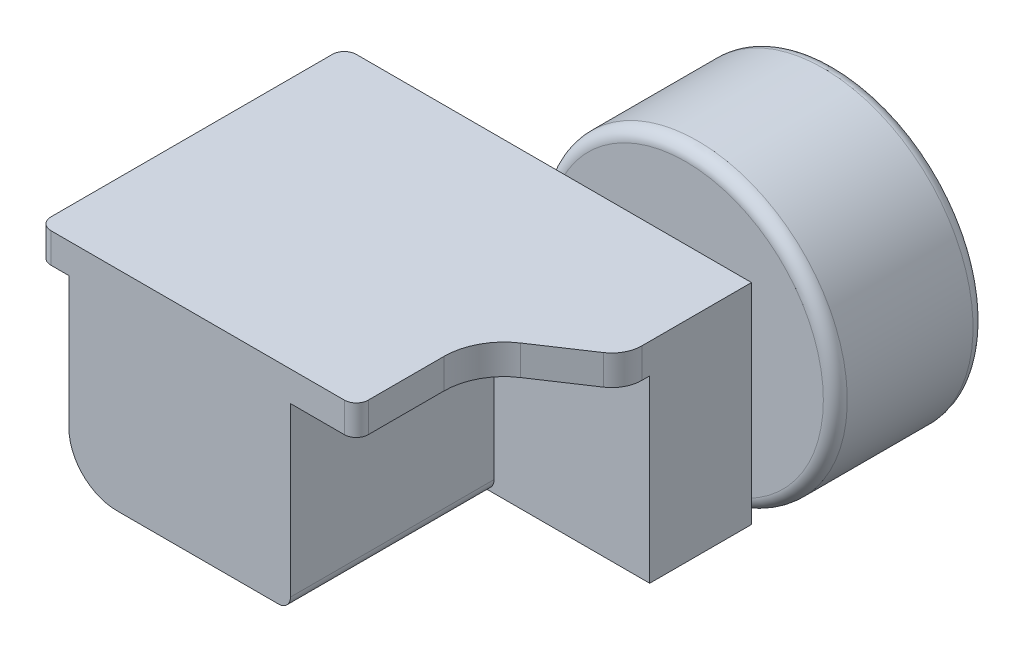
ISO-10303-21;
HEADER;
FILE_DESCRIPTION(('STEP AP214'),'2;1');
FILE_NAME('part.step','',(''),(''),'','','');
FILE_SCHEMA(('AUTOMOTIVE_DESIGN { 1 0 10303 214 1 1 1 1 }'));
ENDSEC;
DATA;
#1=APPLICATION_CONTEXT('core data for automotive mechanical design processes');
#2=APPLICATION_PROTOCOL_DEFINITION('international standard','automotive_design',2000,#1);
#3=PRODUCT_CONTEXT('',#1,'mechanical');
#4=PRODUCT('Part','Part','',(#3));
#5=PRODUCT_RELATED_PRODUCT_CATEGORY('part','',(#4));
#6=PRODUCT_DEFINITION_FORMATION('','',#4);
#7=PRODUCT_DEFINITION_CONTEXT('part definition',#1,'design');
#8=PRODUCT_DEFINITION('design','',#6,#7);
#9=PRODUCT_DEFINITION_SHAPE('','',#8);
#10=(LENGTH_UNIT() NAMED_UNIT(*) SI_UNIT(.MILLI.,.METRE.));
#11=(NAMED_UNIT(*) PLANE_ANGLE_UNIT() SI_UNIT($,.RADIAN.));
#12=(NAMED_UNIT(*) SI_UNIT($,.STERADIAN.) SOLID_ANGLE_UNIT());
#13=UNCERTAINTY_MEASURE_WITH_UNIT(LENGTH_MEASURE(1.E-05),#10,'distance_accuracy_value','');
#14=(GEOMETRIC_REPRESENTATION_CONTEXT(3) GLOBAL_UNCERTAINTY_ASSIGNED_CONTEXT((#13)) GLOBAL_UNIT_ASSIGNED_CONTEXT((#10,
#11,#12)) REPRESENTATION_CONTEXT('',''));
#15=CARTESIAN_POINT('',(0.,0.,0.));
#16=DIRECTION('',(0.,0.,1.));
#17=DIRECTION('',(1.,0.,0.));
#18=AXIS2_PLACEMENT_3D('',#15,#16,#17);
#19=CARTESIAN_POINT('',(0.,0.,51.));
#20=DIRECTION('',(1.,0.,0.));
#21=DIRECTION('',(0.,0.,-1.));
#22=AXIS2_PLACEMENT_3D('',#19,#20,#21);
#23=PLANE('',#22);
#24=DIRECTION('',(0.,0.,-1.));
#25=VECTOR('',#24,1.);
#26=CARTESIAN_POINT('',(0.,30.,51.));
#27=LINE('',#26,#25);
#28=CARTESIAN_POINT('',(0.,30.,49.));
#29=VERTEX_POINT('',#28);
#30=CARTESIAN_POINT('',(0.,30.,2.));
#31=VERTEX_POINT('',#30);
#32=EDGE_CURVE('E181',#29,#31,#27,.T.);
#33=ORIENTED_EDGE('',*,*,#32,.F.);
#34=DIRECTION('',(0.,-1.,0.));
#35=VECTOR('',#34,1.);
#36=CARTESIAN_POINT('',(0.,0.,49.));
#37=LINE('',#36,#35);
#38=CARTESIAN_POINT('',(0.,35.,49.));
#39=VERTEX_POINT('',#38);
#40=EDGE_CURVE('E353',#29,#39,#37,.F.);
#41=ORIENTED_EDGE('',*,*,#40,.T.);
#42=DIRECTION('',(0.,0.,-1.));
#43=VECTOR('',#42,1.);
#44=CARTESIAN_POINT('',(0.,35.,51.));
#45=LINE('',#44,#43);
#46=CARTESIAN_POINT('',(0.,35.,2.));
#47=VERTEX_POINT('',#46);
#48=EDGE_CURVE('E257',#39,#47,#45,.T.);
#49=ORIENTED_EDGE('',*,*,#48,.T.);
#50=DIRECTION('',(0.,-1.,0.));
#51=VECTOR('',#50,1.);
#52=CARTESIAN_POINT('',(0.,30.,2.));
#53=LINE('',#52,#51);
#54=EDGE_CURVE('E350',#47,#31,#53,.T.);
#55=ORIENTED_EDGE('',*,*,#54,.T.);
#56=EDGE_LOOP('',(#33,#41,#49,#55));
#57=FACE_BOUND('',#56,.T.);
#58=ADVANCED_FACE('F37',(#57),#23,.F.);
#59=CARTESIAN_POINT('',(0.,0.,0.));
#60=DIRECTION('',(0.,0.,-1.));
#61=DIRECTION('',(-1.,0.,0.));
#62=AXIS2_PLACEMENT_3D('',#59,#60,#61);
#63=PLANE('',#62);
#64=DIRECTION('',(1.,0.,0.));
#65=VECTOR('',#64,1.);
#66=CARTESIAN_POINT('',(0.,30.,0.));
#67=LINE('',#66,#65);
#68=CARTESIAN_POINT('',(2.,30.,0.));
#69=VERTEX_POINT('',#68);
#70=CARTESIAN_POINT('',(13.,30.,0.));
#71=VERTEX_POINT('',#70);
#72=EDGE_CURVE('E170',#69,#71,#67,.T.);
#73=ORIENTED_EDGE('',*,*,#72,.F.);
#74=DIRECTION('',(0.,-1.,0.));
#75=VECTOR('',#74,1.);
#76=CARTESIAN_POINT('',(2.,35.,0.));
#77=LINE('',#76,#75);
#78=CARTESIAN_POINT('',(2.,35.,0.));
#79=VERTEX_POINT('',#78);
#80=EDGE_CURVE('E12',#69,#79,#77,.F.);
#81=ORIENTED_EDGE('',*,*,#80,.T.);
#82=DIRECTION('',(-1.,0.,0.));
#83=VECTOR('',#82,1.);
#84=CARTESIAN_POINT('',(0.,35.,0.));
#85=LINE('',#84,#83);
#86=CARTESIAN_POINT('',(68.,35.,0.));
#87=VERTEX_POINT('',#86);
#88=EDGE_CURVE('E254',#87,#79,#85,.T.);
#89=ORIENTED_EDGE('',*,*,#88,.F.);
#90=DIRECTION('',(0.,1.,0.));
#91=VECTOR('',#90,1.);
#92=CARTESIAN_POINT('',(68.,0.,0.));
#93=LINE('',#92,#91);
#94=CARTESIAN_POINT('',(68.,0.,0.));
#95=VERTEX_POINT('',#94);
#96=EDGE_CURVE('E259',#95,#87,#93,.T.);
#97=ORIENTED_EDGE('',*,*,#96,.F.);
#98=DIRECTION('',(1.,0.,0.));
#99=VECTOR('',#98,1.);
#100=CARTESIAN_POINT('',(0.,0.,0.));
#101=LINE('',#100,#99);
#102=CARTESIAN_POINT('',(13.,0.,0.));
#103=VERTEX_POINT('',#102);
#104=EDGE_CURVE('E197',#103,#95,#101,.T.);
#105=ORIENTED_EDGE('',*,*,#104,.F.);
#106=DIRECTION('',(0.,-1.,0.));
#107=VECTOR('',#106,1.);
#108=CARTESIAN_POINT('',(13.,30.,0.));
#109=LINE('',#108,#107);
#110=EDGE_CURVE('E186',#71,#103,#109,.T.);
#111=ORIENTED_EDGE('',*,*,#110,.F.);
#112=EDGE_LOOP('',(#73,#81,#89,#97,#105,#111));
#113=FACE_BOUND('',#112,.T.);
#114=CARTESIAN_POINT('',(50.,17.,0.));
#115=DIRECTION('',(0.,0.,-1.));
#116=DIRECTION('',(-1.,0.,0.));
#117=AXIS2_PLACEMENT_3D('',#114,#115,#116);
#118=CIRCLE('',#117,6.);
#119=CARTESIAN_POINT('',(44.,17.,0.));
#120=VERTEX_POINT('',#119);
#121=EDGE_CURVE('E244',#120,#120,#118,.T.);
#122=ORIENTED_EDGE('',*,*,#121,.F.);
#123=EDGE_LOOP('',(#122));
#124=FACE_BOUND('',#123,.T.);
#125=ADVANCED_FACE('F194',(#113,#124),#63,.T.);
#126=CARTESIAN_POINT('',(0.,0.,51.));
#127=DIRECTION('',(0.,1.,0.));
#128=DIRECTION('',(0.,0.,1.));
#129=AXIS2_PLACEMENT_3D('',#126,#127,#128);
#130=PLANE('',#129);
#131=DIRECTION('',(1.,0.,0.));
#132=VECTOR('',#131,1.);
#133=CARTESIAN_POINT('',(68.,0.,17.));
#134=LINE('',#133,#132);
#135=CARTESIAN_POINT('',(40.,0.,17.));
#136=VERTEX_POINT('',#135);
#137=CARTESIAN_POINT('',(68.,0.,17.));
#138=VERTEX_POINT('',#137);
#139=EDGE_CURVE('E209',#136,#138,#134,.T.);
#140=ORIENTED_EDGE('',*,*,#139,.F.);
#141=DIRECTION('',(0.,0.,-1.));
#142=VECTOR('',#141,1.);
#143=CARTESIAN_POINT('',(40.,0.,51.));
#144=LINE('',#143,#142);
#145=CARTESIAN_POINT('',(40.,0.,51.));
#146=VERTEX_POINT('',#145);
#147=EDGE_CURVE('E334',#136,#146,#144,.F.);
#148=ORIENTED_EDGE('',*,*,#147,.T.);
#149=DIRECTION('',(1.,0.,0.));
#150=VECTOR('',#149,1.);
#151=CARTESIAN_POINT('',(0.,0.,51.));
#152=LINE('',#151,#150);
#153=CARTESIAN_POINT('',(13.,0.,51.));
#154=VERTEX_POINT('',#153);
#155=EDGE_CURVE('E250',#154,#146,#152,.T.);
#156=ORIENTED_EDGE('',*,*,#155,.F.);
#157=DIRECTION('',(0.,0.,1.));
#158=VECTOR('',#157,1.);
#159=CARTESIAN_POINT('',(13.,0.,51.));
#160=LINE('',#159,#158);
#161=CARTESIAN_POINT('',(13.,0.,14.));
#162=VERTEX_POINT('',#161);
#163=EDGE_CURVE('E327',#154,#162,#160,.F.);
#164=ORIENTED_EDGE('',*,*,#163,.T.);
#165=DIRECTION('',(0.,0.,1.));
#166=VECTOR('',#165,1.);
#167=CARTESIAN_POINT('',(13.,0.,0.));
#168=LINE('',#167,#166);
#169=EDGE_CURVE('E447',#103,#162,#168,.T.);
#170=ORIENTED_EDGE('',*,*,#169,.F.);
#171=ORIENTED_EDGE('',*,*,#104,.T.);
#172=DIRECTION('',(0.,0.,-1.));
#173=VECTOR('',#172,1.);
#174=CARTESIAN_POINT('',(68.,0.,51.));
#175=LINE('',#174,#173);
#176=EDGE_CURVE('E268',#138,#95,#175,.T.);
#177=ORIENTED_EDGE('',*,*,#176,.F.);
#178=EDGE_LOOP('',(#140,#148,#156,#164,#170,#171,#177));
#179=FACE_BOUND('',#178,.T.);
#180=ADVANCED_FACE('F388',(#179),#130,.F.);
#181=CARTESIAN_POINT('',(68.,0.,51.));
#182=DIRECTION('',(-1.,0.,0.));
#183=DIRECTION('',(0.,0.,1.));
#184=AXIS2_PLACEMENT_3D('',#181,#182,#183);
#185=PLANE('',#184);
#186=DIRECTION('',(0.,0.,1.));
#187=VECTOR('',#186,1.);
#188=CARTESIAN_POINT('',(68.,30.,51.));
#189=LINE('',#188,#187);
#190=CARTESIAN_POINT('',(68.,30.,17.));
#191=VERTEX_POINT('',#190);
#192=CARTESIAN_POINT('',(68.,30.,18.32408120756));
#193=VERTEX_POINT('',#192);
#194=EDGE_CURVE('E206',#191,#193,#189,.T.);
#195=ORIENTED_EDGE('',*,*,#194,.F.);
#196=DIRECTION('',(0.,-1.,0.));
#197=VECTOR('',#196,1.);
#198=CARTESIAN_POINT('',(68.,30.,17.));
#199=LINE('',#198,#197);
#200=EDGE_CURVE('E220',#191,#138,#199,.T.);
#201=ORIENTED_EDGE('',*,*,#200,.T.);
#202=ORIENTED_EDGE('',*,*,#176,.T.);
#203=ORIENTED_EDGE('',*,*,#96,.T.);
#204=DIRECTION('',(0.,0.,-1.));
#205=VECTOR('',#204,1.);
#206=CARTESIAN_POINT('',(68.,35.,51.));
#207=LINE('',#206,#205);
#208=CARTESIAN_POINT('',(68.,35.,18.32408120756));
#209=VERTEX_POINT('',#208);
#210=EDGE_CURVE('E266',#209,#87,#207,.T.);
#211=ORIENTED_EDGE('',*,*,#210,.F.);
#212=DIRECTION('',(0.,-1.,0.));
#213=VECTOR('',#212,1.);
#214=CARTESIAN_POINT('',(68.,0.,18.32408120756));
#215=LINE('',#214,#213);
#216=EDGE_CURVE('E313',#209,#193,#215,.T.);
#217=ORIENTED_EDGE('',*,*,#216,.T.);
#218=EDGE_LOOP('',(#195,#201,#202,#203,#211,#217));
#219=FACE_BOUND('',#218,.T.);
#220=ADVANCED_FACE('F445',(#219),#185,.F.);
#221=CARTESIAN_POINT('',(0.,35.,51.));
#222=DIRECTION('',(0.,-1.,0.));
#223=DIRECTION('',(0.,0.,-1.));
#224=AXIS2_PLACEMENT_3D('',#221,#222,#223);
#225=PLANE('',#224);
#226=ORIENTED_EDGE('',*,*,#48,.F.);
#227=CARTESIAN_POINT('',(2.,35.,49.));
#228=DIRECTION('',(0.,-1.,0.));
#229=DIRECTION('',(0.,0.,-1.));
#230=AXIS2_PLACEMENT_3D('',#227,#228,#229);
#231=CIRCLE('',#230,2.);
#232=CARTESIAN_POINT('',(2.,35.,51.));
#233=VERTEX_POINT('',#232);
#234=EDGE_CURVE('E358',#39,#233,#231,.F.);
#235=ORIENTED_EDGE('',*,*,#234,.T.);
#236=DIRECTION('',(-1.,0.,0.));
#237=VECTOR('',#236,1.);
#238=CARTESIAN_POINT('',(0.,35.,51.));
#239=LINE('',#238,#237);
#240=CARTESIAN_POINT('',(51.,35.,51.));
#241=VERTEX_POINT('',#240);
#242=EDGE_CURVE('E253',#241,#233,#239,.T.);
#243=ORIENTED_EDGE('',*,*,#242,.F.);
#244=CARTESIAN_POINT('',(51.,35.,49.));
#245=DIRECTION('',(0.,-1.,0.));
#246=DIRECTION('',(0.,0.,-1.));
#247=AXIS2_PLACEMENT_3D('',#244,#245,#246);
#248=CIRCLE('',#247,2.);
#249=CARTESIAN_POINT('',(53.,35.,49.));
#250=VERTEX_POINT('',#249);
#251=EDGE_CURVE('E60',#241,#250,#248,.F.);
#252=ORIENTED_EDGE('',*,*,#251,.T.);
#253=DIRECTION('',(0.,0.,-1.));
#254=VECTOR('',#253,1.);
#255=CARTESIAN_POINT('',(53.,35.,51.));
#256=LINE('',#255,#254);
#257=CARTESIAN_POINT('',(53.,35.,36.35183758488));
#258=VERTEX_POINT('',#257);
#259=EDGE_CURVE('E240',#250,#258,#256,.T.);
#260=ORIENTED_EDGE('',*,*,#259,.T.);
#261=CARTESIAN_POINT('',(63.,35.,36.35183758488));
#262=DIRECTION('',(0.,-1.,0.));
#263=DIRECTION('',(0.,0.,-1.));
#264=AXIS2_PLACEMENT_3D('',#261,#262,#263);
#265=CIRCLE('',#264,10.);
#266=CARTESIAN_POINT('',(57.4529980377478,35.,28.0313346415015));
#267=VERTEX_POINT('',#266);
#268=EDGE_CURVE('E307',#258,#267,#265,.T.);
#269=ORIENTED_EDGE('',*,*,#268,.T.);
#270=DIRECTION('',(0.832050294337844,0.,-0.554700196225229));
#271=VECTOR('',#270,1.);
#272=CARTESIAN_POINT('',(7.07692307692307,35.,61.6153846153846));
#273=LINE('',#272,#271);
#274=CARTESIAN_POINT('',(65.7735009811262,35.,22.4843326792492));
#275=VERTEX_POINT('',#274);
#276=EDGE_CURVE('E310',#267,#275,#273,.T.);
#277=ORIENTED_EDGE('',*,*,#276,.T.);
#278=CARTESIAN_POINT('',(63.,35.,18.32408120756));
#279=DIRECTION('',(0.,-1.,0.));
#280=DIRECTION('',(0.,0.,-1.));
#281=AXIS2_PLACEMENT_3D('',#278,#279,#280);
#282=CIRCLE('',#281,5.);
#283=EDGE_CURVE('E318',#275,#209,#282,.F.);
#284=ORIENTED_EDGE('',*,*,#283,.T.);
#285=ORIENTED_EDGE('',*,*,#210,.T.);
#286=ORIENTED_EDGE('',*,*,#88,.T.);
#287=CARTESIAN_POINT('',(2.,35.,2.));
#288=DIRECTION('',(0.,-1.,0.));
#289=DIRECTION('',(0.,0.,-1.));
#290=AXIS2_PLACEMENT_3D('',#287,#288,#289);
#291=CIRCLE('',#290,2.);
#292=EDGE_CURVE('E355',#79,#47,#291,.F.);
#293=ORIENTED_EDGE('',*,*,#292,.T.);
#294=EDGE_LOOP('',(#226,#235,#243,#252,#260,#269,#277,#284,#285,#286,#293));
#295=FACE_BOUND('',#294,.T.);
#296=ADVANCED_FACE('F520',(#295),#225,.F.);
#297=CARTESIAN_POINT('',(0.,0.,51.));
#298=DIRECTION('',(0.,0.,-1.));
#299=DIRECTION('',(-1.,0.,0.));
#300=AXIS2_PLACEMENT_3D('',#297,#298,#299);
#301=PLANE('',#300);
#302=ORIENTED_EDGE('',*,*,#242,.T.);
#303=DIRECTION('',(0.,-1.,0.));
#304=VECTOR('',#303,1.);
#305=CARTESIAN_POINT('',(2.,0.,51.));
#306=LINE('',#305,#304);
#307=CARTESIAN_POINT('',(2.,30.,51.));
#308=VERTEX_POINT('',#307);
#309=EDGE_CURVE('E344',#233,#308,#306,.T.);
#310=ORIENTED_EDGE('',*,*,#309,.T.);
#311=DIRECTION('',(-1.,0.,0.));
#312=VECTOR('',#311,1.);
#313=CARTESIAN_POINT('',(5.,30.,51.));
#314=LINE('',#313,#312);
#315=CARTESIAN_POINT('',(5.,30.,51.));
#316=VERTEX_POINT('',#315);
#317=EDGE_CURVE('E198',#316,#308,#314,.T.);
#318=ORIENTED_EDGE('',*,*,#317,.F.);
#319=DIRECTION('',(0.,-1.,0.));
#320=VECTOR('',#319,1.);
#321=CARTESIAN_POINT('',(5.,30.,51.));
#322=LINE('',#321,#320);
#323=CARTESIAN_POINT('',(5.,8.,51.));
#324=VERTEX_POINT('',#323);
#325=EDGE_CURVE('E219',#316,#324,#322,.T.);
#326=ORIENTED_EDGE('',*,*,#325,.T.);
#327=CARTESIAN_POINT('',(13.,8.,51.));
#328=DIRECTION('',(0.,0.,-1.));
#329=DIRECTION('',(-1.,0.,0.));
#330=AXIS2_PLACEMENT_3D('',#327,#328,#329);
#331=CIRCLE('',#330,8.);
#332=EDGE_CURVE('E325',#324,#154,#331,.F.);
#333=ORIENTED_EDGE('',*,*,#332,.T.);
#334=ORIENTED_EDGE('',*,*,#155,.T.);
#335=CARTESIAN_POINT('',(40.,2.,51.));
#336=DIRECTION('',(0.,0.,-1.));
#337=DIRECTION('',(-1.,0.,0.));
#338=AXIS2_PLACEMENT_3D('',#335,#336,#337);
#339=CIRCLE('',#338,2.);
#340=CARTESIAN_POINT('',(42.,2.,51.));
#341=VERTEX_POINT('',#340);
#342=EDGE_CURVE('E336',#146,#341,#339,.F.);
#343=ORIENTED_EDGE('',*,*,#342,.T.);
#344=DIRECTION('',(0.,-1.,0.));
#345=VECTOR('',#344,1.);
#346=CARTESIAN_POINT('',(42.,30.,51.));
#347=LINE('',#346,#345);
#348=CARTESIAN_POINT('',(42.,30.,51.));
#349=VERTEX_POINT('',#348);
#350=EDGE_CURVE('E217',#349,#341,#347,.T.);
#351=ORIENTED_EDGE('',*,*,#350,.F.);
#352=DIRECTION('',(-1.,0.,0.));
#353=VECTOR('',#352,1.);
#354=CARTESIAN_POINT('',(68.,30.,51.));
#355=LINE('',#354,#353);
#356=CARTESIAN_POINT('',(51.,30.,51.));
#357=VERTEX_POINT('',#356);
#358=EDGE_CURVE('E208',#357,#349,#355,.T.);
#359=ORIENTED_EDGE('',*,*,#358,.F.);
#360=DIRECTION('',(0.,1.,0.));
#361=VECTOR('',#360,1.);
#362=CARTESIAN_POINT('',(51.,0.,51.));
#363=LINE('',#362,#361);
#364=EDGE_CURVE('E341',#357,#241,#363,.T.);
#365=ORIENTED_EDGE('',*,*,#364,.T.);
#366=EDGE_LOOP('',(#302,#310,#318,#326,#333,#334,#343,#351,#359,#365));
#367=FACE_BOUND('',#366,.T.);
#368=ADVANCED_FACE('F370',(#367),#301,.F.);
#369=CARTESIAN_POINT('',(50.,17.,-7.));
#370=DIRECTION('',(0.,0.,1.));
#371=DIRECTION('',(1.,0.,0.));
#372=AXIS2_PLACEMENT_3D('',#369,#370,#371);
#373=CYLINDRICAL_SURFACE('',#372,6.);
#374=CARTESIAN_POINT('',(50.,17.,-7.));
#375=DIRECTION('',(0.,0.,-1.));
#376=DIRECTION('',(-1.,0.,0.));
#377=AXIS2_PLACEMENT_3D('',#374,#375,#376);
#378=CIRCLE('',#377,6.);
#379=CARTESIAN_POINT('',(44.,17.,-7.));
#380=VERTEX_POINT('',#379);
#381=EDGE_CURVE('E245',#380,#380,#378,.T.);
#382=ORIENTED_EDGE('',*,*,#381,.F.);
#383=EDGE_LOOP('',(#382));
#384=FACE_BOUND('',#383,.T.);
#385=ORIENTED_EDGE('',*,*,#121,.T.);
#386=EDGE_LOOP('',(#385));
#387=FACE_BOUND('',#386,.T.);
#388=ADVANCED_FACE('F511',(#384,#387),#373,.T.);
#389=CARTESIAN_POINT('',(50.,17.,-7.));
#390=DIRECTION('',(0.,0.,-1.));
#391=DIRECTION('',(-1.,0.,0.));
#392=AXIS2_PLACEMENT_3D('',#389,#390,#391);
#393=PLANE('',#392);
#394=CARTESIAN_POINT('',(50.,17.,-7.));
#395=DIRECTION('',(0.,0.,-1.));
#396=DIRECTION('',(-1.,0.,0.));
#397=AXIS2_PLACEMENT_3D('',#394,#395,#396);
#398=CIRCLE('',#397,23.);
#399=CARTESIAN_POINT('',(27.,17.,-7.));
#400=VERTEX_POINT('',#399);
#401=EDGE_CURVE('E298',#400,#400,#398,.F.);
#402=ORIENTED_EDGE('',*,*,#401,.T.);
#403=EDGE_LOOP('',(#402));
#404=FACE_BOUND('',#403,.T.);
#405=ORIENTED_EDGE('',*,*,#381,.T.);
#406=EDGE_LOOP('',(#405));
#407=FACE_BOUND('',#406,.T.);
#408=ADVANCED_FACE('F508',(#404,#407),#393,.F.);
#409=CARTESIAN_POINT('',(50.,17.,-32.));
#410=DIRECTION('',(0.,0.,1.));
#411=DIRECTION('',(1.,0.,0.));
#412=AXIS2_PLACEMENT_3D('',#409,#410,#411);
#413=CYLINDRICAL_SURFACE('',#412,25.);
#414=CARTESIAN_POINT('',(50.,17.,-30.));
#415=DIRECTION('',(0.,0.,-1.));
#416=DIRECTION('',(-1.,0.,0.));
#417=AXIS2_PLACEMENT_3D('',#414,#415,#416);
#418=CIRCLE('',#417,25.);
#419=CARTESIAN_POINT('',(25.,17.,-30.));
#420=VERTEX_POINT('',#419);
#421=EDGE_CURVE('E280',#420,#420,#418,.F.);
#422=ORIENTED_EDGE('',*,*,#421,.T.);
#423=EDGE_LOOP('',(#422));
#424=FACE_BOUND('',#423,.T.);
#425=CARTESIAN_POINT('',(50.,17.,-9.));
#426=DIRECTION('',(0.,0.,-1.));
#427=DIRECTION('',(-1.,0.,0.));
#428=AXIS2_PLACEMENT_3D('',#425,#426,#427);
#429=CIRCLE('',#428,25.);
#430=CARTESIAN_POINT('',(25.,17.,-9.));
#431=VERTEX_POINT('',#430);
#432=EDGE_CURVE('E277',#431,#431,#429,.T.);
#433=ORIENTED_EDGE('',*,*,#432,.T.);
#434=EDGE_LOOP('',(#433));
#435=FACE_BOUND('',#434,.T.);
#436=ADVANCED_FACE('F506',(#424,#435),#413,.T.);
#437=CARTESIAN_POINT('',(50.,17.,-32.));
#438=DIRECTION('',(0.,0.,-1.));
#439=DIRECTION('',(-1.,0.,0.));
#440=AXIS2_PLACEMENT_3D('',#437,#438,#439);
#441=PLANE('',#440);
#442=CARTESIAN_POINT('',(50.,17.,-32.));
#443=DIRECTION('',(0.,0.,-1.));
#444=DIRECTION('',(-1.,0.,0.));
#445=AXIS2_PLACEMENT_3D('',#442,#443,#444);
#446=CIRCLE('',#445,23.);
#447=CARTESIAN_POINT('',(27.,17.,-32.));
#448=VERTEX_POINT('',#447);
#449=EDGE_CURVE('E274',#448,#448,#446,.T.);
#450=ORIENTED_EDGE('',*,*,#449,.T.);
#451=EDGE_LOOP('',(#450));
#452=FACE_BOUND('',#451,.T.);
#453=CARTESIAN_POINT('',(50.,17.,-32.));
#454=DIRECTION('',(0.,0.,-1.));
#455=DIRECTION('',(-1.,0.,0.));
#456=AXIS2_PLACEMENT_3D('',#453,#454,#455);
#457=CIRCLE('',#456,20.);
#458=CARTESIAN_POINT('',(30.,17.,-32.));
#459=VERTEX_POINT('',#458);
#460=EDGE_CURVE('E271',#459,#459,#457,.F.);
#461=ORIENTED_EDGE('',*,*,#460,.T.);
#462=EDGE_LOOP('',(#461));
#463=FACE_BOUND('',#462,.T.);
#464=ADVANCED_FACE('F502',(#452,#463),#441,.T.);
#465=CARTESIAN_POINT('',(50.,17.,-25.));
#466=DIRECTION('',(0.,0.,-1.));
#467=DIRECTION('',(-1.,0.,0.));
#468=AXIS2_PLACEMENT_3D('',#465,#466,#467);
#469=CYLINDRICAL_SURFACE('',#468,18.);
#470=CARTESIAN_POINT('',(50.,17.,-30.));
#471=DIRECTION('',(0.,0.,-1.));
#472=DIRECTION('',(-1.,0.,0.));
#473=AXIS2_PLACEMENT_3D('',#470,#471,#472);
#474=CIRCLE('',#473,18.);
#475=CARTESIAN_POINT('',(32.,17.,-30.));
#476=VERTEX_POINT('',#475);
#477=EDGE_CURVE('E286',#476,#476,#474,.T.);
#478=ORIENTED_EDGE('',*,*,#477,.T.);
#479=EDGE_LOOP('',(#478));
#480=FACE_BOUND('',#479,.T.);
#481=CARTESIAN_POINT('',(50.,17.,-27.));
#482=DIRECTION('',(0.,0.,-1.));
#483=DIRECTION('',(-1.,0.,0.));
#484=AXIS2_PLACEMENT_3D('',#481,#482,#483);
#485=CIRCLE('',#484,18.);
#486=CARTESIAN_POINT('',(32.,17.,-27.));
#487=VERTEX_POINT('',#486);
#488=EDGE_CURVE('E283',#487,#487,#485,.F.);
#489=ORIENTED_EDGE('',*,*,#488,.T.);
#490=EDGE_LOOP('',(#489));
#491=FACE_BOUND('',#490,.T.);
#492=ADVANCED_FACE('F498',(#480,#491),#469,.F.);
#493=CARTESIAN_POINT('',(50.,17.,-25.));
#494=DIRECTION('',(0.,0.,-1.));
#495=DIRECTION('',(-1.,0.,0.));
#496=AXIS2_PLACEMENT_3D('',#493,#494,#495);
#497=PLANE('',#496);
#498=CARTESIAN_POINT('',(50.,17.,-25.));
#499=DIRECTION('',(0.,0.,-1.));
#500=DIRECTION('',(-1.,0.,0.));
#501=AXIS2_PLACEMENT_3D('',#498,#499,#500);
#502=CIRCLE('',#501,8.);
#503=CARTESIAN_POINT('',(42.,17.,-25.));
#504=VERTEX_POINT('',#503);
#505=EDGE_CURVE('E304',#504,#504,#502,.F.);
#506=ORIENTED_EDGE('',*,*,#505,.T.);
#507=EDGE_LOOP('',(#506));
#508=FACE_BOUND('',#507,.T.);
#509=CARTESIAN_POINT('',(50.,17.,-25.));
#510=DIRECTION('',(0.,0.,-1.));
#511=DIRECTION('',(-1.,0.,0.));
#512=AXIS2_PLACEMENT_3D('',#509,#510,#511);
#513=CIRCLE('',#512,16.);
#514=CARTESIAN_POINT('',(34.,17.,-25.));
#515=VERTEX_POINT('',#514);
#516=EDGE_CURVE('E301',#515,#515,#513,.T.);
#517=ORIENTED_EDGE('',*,*,#516,.T.);
#518=EDGE_LOOP('',(#517));
#519=FACE_BOUND('',#518,.T.);
#520=ADVANCED_FACE('F494',(#508,#519),#497,.T.);
#521=CARTESIAN_POINT('',(50.,17.,-25.));
#522=DIRECTION('',(0.,0.,-1.));
#523=DIRECTION('',(-1.,0.,0.));
#524=AXIS2_PLACEMENT_3D('',#521,#522,#523);
#525=CYLINDRICAL_SURFACE('',#524,6.);
#526=CARTESIAN_POINT('',(50.,17.,-30.));
#527=DIRECTION('',(0.,0.,-1.));
#528=DIRECTION('',(-1.,0.,0.));
#529=AXIS2_PLACEMENT_3D('',#526,#527,#528);
#530=CIRCLE('',#529,6.);
#531=CARTESIAN_POINT('',(44.,17.,-30.));
#532=VERTEX_POINT('',#531);
#533=EDGE_CURVE('E295',#532,#532,#530,.F.);
#534=ORIENTED_EDGE('',*,*,#533,.T.);
#535=EDGE_LOOP('',(#534));
#536=FACE_BOUND('',#535,.T.);
#537=CARTESIAN_POINT('',(50.,17.,-27.));
#538=DIRECTION('',(0.,0.,-1.));
#539=DIRECTION('',(-1.,0.,0.));
#540=AXIS2_PLACEMENT_3D('',#537,#538,#539);
#541=CIRCLE('',#540,6.);
#542=CARTESIAN_POINT('',(44.,17.,-27.));
#543=VERTEX_POINT('',#542);
#544=EDGE_CURVE('E292',#543,#543,#541,.T.);
#545=ORIENTED_EDGE('',*,*,#544,.T.);
#546=EDGE_LOOP('',(#545));
#547=FACE_BOUND('',#546,.T.);
#548=ADVANCED_FACE('F491',(#536,#547),#525,.T.);
#549=CARTESIAN_POINT('',(50.,17.,-32.));
#550=DIRECTION('',(0.,0.,-1.));
#551=DIRECTION('',(-1.,0.,0.));
#552=AXIS2_PLACEMENT_3D('',#549,#550,#551);
#553=CIRCLE('',#552,4.);
#554=CARTESIAN_POINT('',(46.,17.,-32.));
#555=VERTEX_POINT('',#554);
#556=EDGE_CURVE('E289',#555,#555,#553,.T.);
#557=ORIENTED_EDGE('',*,*,#556,.T.);
#558=EDGE_LOOP('',(#557));
#559=FACE_BOUND('',#558,.T.);
#560=ADVANCED_FACE('F398',(#559),#441,.T.);
#561=CARTESIAN_POINT('',(50.,17.,-30.));
#562=DIRECTION('',(0.,0.,-1.));
#563=DIRECTION('',(-1.,0.,0.));
#564=AXIS2_PLACEMENT_3D('',#561,#562,#563);
#565=TOROIDAL_SURFACE('',#564,23.,2.);
#566=ORIENTED_EDGE('',*,*,#421,.F.);
#567=EDGE_LOOP('',(#566));
#568=FACE_BOUND('',#567,.T.);
#569=ORIENTED_EDGE('',*,*,#449,.F.);
#570=EDGE_LOOP('',(#569));
#571=FACE_BOUND('',#570,.T.);
#572=ADVANCED_FACE('F394',(#568,#571),#565,.T.);
#573=CARTESIAN_POINT('',(50.,17.,-30.));
#574=DIRECTION('',(0.,0.,-1.));
#575=DIRECTION('',(-1.,0.,0.));
#576=AXIS2_PLACEMENT_3D('',#573,#574,#575);
#577=TOROIDAL_SURFACE('',#576,20.,2.);
#578=ORIENTED_EDGE('',*,*,#460,.F.);
#579=EDGE_LOOP('',(#578));
#580=FACE_BOUND('',#579,.T.);
#581=ORIENTED_EDGE('',*,*,#477,.F.);
#582=EDGE_LOOP('',(#581));
#583=FACE_BOUND('',#582,.T.);
#584=ADVANCED_FACE('F397',(#580,#583),#577,.T.);
#585=CARTESIAN_POINT('',(50.,17.,-30.));
#586=DIRECTION('',(0.,0.,-1.));
#587=DIRECTION('',(-1.,0.,0.));
#588=AXIS2_PLACEMENT_3D('',#585,#586,#587);
#589=TOROIDAL_SURFACE('',#588,4.,2.);
#590=ORIENTED_EDGE('',*,*,#533,.F.);
#591=EDGE_LOOP('',(#590));
#592=FACE_BOUND('',#591,.T.);
#593=ORIENTED_EDGE('',*,*,#556,.F.);
#594=EDGE_LOOP('',(#593));
#595=FACE_BOUND('',#594,.T.);
#596=ADVANCED_FACE('F402',(#592,#595),#589,.T.);
#597=CARTESIAN_POINT('',(50.,17.,-9.));
#598=DIRECTION('',(0.,0.,-1.));
#599=DIRECTION('',(-1.,0.,0.));
#600=AXIS2_PLACEMENT_3D('',#597,#598,#599);
#601=TOROIDAL_SURFACE('',#600,23.,2.);
#602=ORIENTED_EDGE('',*,*,#401,.F.);
#603=EDGE_LOOP('',(#602));
#604=FACE_BOUND('',#603,.T.);
#605=ORIENTED_EDGE('',*,*,#432,.F.);
#606=EDGE_LOOP('',(#605));
#607=FACE_BOUND('',#606,.T.);
#608=ADVANCED_FACE('F406',(#604,#607),#601,.T.);
#609=CARTESIAN_POINT('',(50.,17.,-27.));
#610=DIRECTION('',(0.,0.,-1.));
#611=DIRECTION('',(-1.,0.,0.));
#612=AXIS2_PLACEMENT_3D('',#609,#610,#611);
#613=TOROIDAL_SURFACE('',#612,8.,2.);
#614=ORIENTED_EDGE('',*,*,#505,.F.);
#615=EDGE_LOOP('',(#614));
#616=FACE_BOUND('',#615,.T.);
#617=ORIENTED_EDGE('',*,*,#544,.F.);
#618=EDGE_LOOP('',(#617));
#619=FACE_BOUND('',#618,.T.);
#620=ADVANCED_FACE('F410',(#616,#619),#613,.F.);
#621=CARTESIAN_POINT('',(50.,17.,-27.));
#622=DIRECTION('',(0.,0.,-1.));
#623=DIRECTION('',(-1.,0.,0.));
#624=AXIS2_PLACEMENT_3D('',#621,#622,#623);
#625=TOROIDAL_SURFACE('',#624,16.,2.);
#626=ORIENTED_EDGE('',*,*,#488,.F.);
#627=EDGE_LOOP('',(#626));
#628=FACE_BOUND('',#627,.T.);
#629=ORIENTED_EDGE('',*,*,#516,.F.);
#630=EDGE_LOOP('',(#629));
#631=FACE_BOUND('',#630,.T.);
#632=ADVANCED_FACE('F414',(#628,#631),#625,.F.);
#633=CARTESIAN_POINT('',(57.4529980377478,42.,28.0313346415015));
#634=DIRECTION('',(-0.554700196225229,0.,-0.832050294337844));
#635=DIRECTION('',(-0.832050294337844,0.,0.554700196225229));
#636=AXIS2_PLACEMENT_3D('',#633,#634,#635);
#637=PLANE('',#636);
#638=DIRECTION('',(0.,-1.,0.));
#639=VECTOR('',#638,1.);
#640=CARTESIAN_POINT('',(57.4529980377478,42.,28.0313346415015));
#641=LINE('',#640,#639);
#642=CARTESIAN_POINT('',(57.4529980377478,30.,28.0313346415015));
#643=VERTEX_POINT('',#642);
#644=EDGE_CURVE('E237',#267,#643,#641,.T.);
#645=ORIENTED_EDGE('',*,*,#644,.T.);
#646=DIRECTION('',(0.832050294337844,0.,-0.554700196225229));
#647=VECTOR('',#646,1.);
#648=CARTESIAN_POINT('',(57.4529980377478,30.,28.0313346415015));
#649=LINE('',#648,#647);
#650=CARTESIAN_POINT('',(65.7735009811262,30.,22.4843326792492));
#651=VERTEX_POINT('',#650);
#652=EDGE_CURVE('E223',#643,#651,#649,.T.);
#653=ORIENTED_EDGE('',*,*,#652,.T.);
#654=DIRECTION('',(0.,-1.,0.));
#655=VECTOR('',#654,1.);
#656=CARTESIAN_POINT('',(65.7735009811261,42.,22.4843326792492));
#657=LINE('',#656,#655);
#658=EDGE_CURVE('E316',#651,#275,#657,.F.);
#659=ORIENTED_EDGE('',*,*,#658,.T.);
#660=ORIENTED_EDGE('',*,*,#276,.F.);
#661=EDGE_LOOP('',(#645,#653,#659,#660));
#662=FACE_BOUND('',#661,.T.);
#663=ADVANCED_FACE('F418',(#662),#637,.F.);
#664=CARTESIAN_POINT('',(63.,42.,36.35183758488));
#665=DIRECTION('',(0.,-1.,0.));
#666=DIRECTION('',(0.,0.,-1.));
#667=AXIS2_PLACEMENT_3D('',#664,#665,#666);
#668=CYLINDRICAL_SURFACE('',#667,10.);
#669=DIRECTION('',(0.,-1.,0.));
#670=VECTOR('',#669,1.);
#671=CARTESIAN_POINT('',(53.,42.,36.35183758488));
#672=LINE('',#671,#670);
#673=CARTESIAN_POINT('',(53.,30.,36.35183758488));
#674=VERTEX_POINT('',#673);
#675=EDGE_CURVE('E236',#258,#674,#672,.T.);
#676=ORIENTED_EDGE('',*,*,#675,.T.);
#677=CARTESIAN_POINT('',(63.,30.,36.35183758488));
#678=DIRECTION('',(0.,1.,0.));
#679=DIRECTION('',(0.,0.,1.));
#680=AXIS2_PLACEMENT_3D('',#677,#678,#679);
#681=CIRCLE('',#680,10.);
#682=EDGE_CURVE('E231',#674,#643,#681,.F.);
#683=ORIENTED_EDGE('',*,*,#682,.T.);
#684=ORIENTED_EDGE('',*,*,#644,.F.);
#685=ORIENTED_EDGE('',*,*,#268,.F.);
#686=EDGE_LOOP('',(#676,#683,#684,#685));
#687=FACE_BOUND('',#686,.T.);
#688=ADVANCED_FACE('F484',(#687),#668,.F.);
#689=CARTESIAN_POINT('',(53.,42.,51.));
#690=DIRECTION('',(-1.,0.,0.));
#691=DIRECTION('',(0.,0.,1.));
#692=AXIS2_PLACEMENT_3D('',#689,#690,#691);
#693=PLANE('',#692);
#694=ORIENTED_EDGE('',*,*,#259,.F.);
#695=DIRECTION('',(0.,1.,0.));
#696=VECTOR('',#695,1.);
#697=CARTESIAN_POINT('',(53.,42.,49.));
#698=LINE('',#697,#696);
#699=CARTESIAN_POINT('',(53.,30.,49.));
#700=VERTEX_POINT('',#699);
#701=EDGE_CURVE('E52',#250,#700,#698,.F.);
#702=ORIENTED_EDGE('',*,*,#701,.T.);
#703=DIRECTION('',(0.,0.,-1.));
#704=VECTOR('',#703,1.);
#705=CARTESIAN_POINT('',(53.,30.,51.));
#706=LINE('',#705,#704);
#707=EDGE_CURVE('E234',#700,#674,#706,.T.);
#708=ORIENTED_EDGE('',*,*,#707,.T.);
#709=ORIENTED_EDGE('',*,*,#675,.F.);
#710=EDGE_LOOP('',(#694,#702,#708,#709));
#711=FACE_BOUND('',#710,.T.);
#712=ADVANCED_FACE('F423',(#711),#693,.F.);
#713=CARTESIAN_POINT('',(63.,0.,18.32408120756));
#714=DIRECTION('',(0.,-1.,0.));
#715=DIRECTION('',(0.,0.,-1.));
#716=AXIS2_PLACEMENT_3D('',#713,#714,#715);
#717=CYLINDRICAL_SURFACE('',#716,5.);
#718=CARTESIAN_POINT('',(63.,30.,18.32408120756));
#719=DIRECTION('',(0.,1.,0.));
#720=DIRECTION('',(0.,0.,1.));
#721=AXIS2_PLACEMENT_3D('',#718,#719,#720);
#722=CIRCLE('',#721,5.);
#723=EDGE_CURVE('E320',#193,#651,#722,.F.);
#724=ORIENTED_EDGE('',*,*,#723,.F.);
#725=ORIENTED_EDGE('',*,*,#216,.F.);
#726=ORIENTED_EDGE('',*,*,#283,.F.);
#727=ORIENTED_EDGE('',*,*,#658,.F.);
#728=EDGE_LOOP('',(#724,#725,#726,#727));
#729=FACE_BOUND('',#728,.T.);
#730=ADVANCED_FACE('F420',(#729),#717,.T.);
#731=CARTESIAN_POINT('',(0.,30.,0.));
#732=DIRECTION('',(0.,1.,0.));
#733=DIRECTION('',(0.,0.,1.));
#734=AXIS2_PLACEMENT_3D('',#731,#732,#733);
#735=PLANE('',#734);
#736=ORIENTED_EDGE('',*,*,#707,.F.);
#737=CARTESIAN_POINT('',(51.,30.,49.));
#738=DIRECTION('',(0.,1.,0.));
#739=DIRECTION('',(0.,0.,1.));
#740=AXIS2_PLACEMENT_3D('',#737,#738,#739);
#741=CIRCLE('',#740,2.);
#742=EDGE_CURVE('E45',#700,#357,#741,.F.);
#743=ORIENTED_EDGE('',*,*,#742,.T.);
#744=ORIENTED_EDGE('',*,*,#358,.T.);
#745=DIRECTION('',(0.,0.,-1.));
#746=VECTOR('',#745,1.);
#747=CARTESIAN_POINT('',(42.,30.,51.));
#748=LINE('',#747,#746);
#749=CARTESIAN_POINT('',(42.,30.,17.));
#750=VERTEX_POINT('',#749);
#751=EDGE_CURVE('E211',#349,#750,#748,.T.);
#752=ORIENTED_EDGE('',*,*,#751,.T.);
#753=DIRECTION('',(1.,0.,0.));
#754=VECTOR('',#753,1.);
#755=CARTESIAN_POINT('',(68.,30.,17.));
#756=LINE('',#755,#754);
#757=EDGE_CURVE('E214',#750,#191,#756,.T.);
#758=ORIENTED_EDGE('',*,*,#757,.T.);
#759=ORIENTED_EDGE('',*,*,#194,.T.);
#760=ORIENTED_EDGE('',*,*,#723,.T.);
#761=ORIENTED_EDGE('',*,*,#652,.F.);
#762=ORIENTED_EDGE('',*,*,#682,.F.);
#763=EDGE_LOOP('',(#736,#743,#744,#752,#758,#759,#760,#761,#762));
#764=FACE_BOUND('',#763,.T.);
#765=ADVANCED_FACE('F363',(#764),#735,.F.);
#766=CARTESIAN_POINT('',(68.,30.,17.));
#767=DIRECTION('',(0.,0.,-1.));
#768=DIRECTION('',(-1.,0.,0.));
#769=AXIS2_PLACEMENT_3D('',#766,#767,#768);
#770=PLANE('',#769);
#771=ORIENTED_EDGE('',*,*,#139,.T.);
#772=ORIENTED_EDGE('',*,*,#200,.F.);
#773=ORIENTED_EDGE('',*,*,#757,.F.);
#774=DIRECTION('',(0.,-1.,0.));
#775=VECTOR('',#774,1.);
#776=CARTESIAN_POINT('',(42.,30.,17.));
#777=LINE('',#776,#775);
#778=CARTESIAN_POINT('',(42.,2.,17.));
#779=VERTEX_POINT('',#778);
#780=EDGE_CURVE('E224',#750,#779,#777,.T.);
#781=ORIENTED_EDGE('',*,*,#780,.T.);
#782=CARTESIAN_POINT('',(40.,2.,17.));
#783=DIRECTION('',(0.,0.,-1.));
#784=DIRECTION('',(-1.,0.,0.));
#785=AXIS2_PLACEMENT_3D('',#782,#783,#784);
#786=CIRCLE('',#785,2.);
#787=EDGE_CURVE('E338',#779,#136,#786,.T.);
#788=ORIENTED_EDGE('',*,*,#787,.T.);
#789=EDGE_LOOP('',(#771,#772,#773,#781,#788));
#790=FACE_BOUND('',#789,.T.);
#791=ADVANCED_FACE('F442',(#790),#770,.F.);
#792=CARTESIAN_POINT('',(42.,30.,51.));
#793=DIRECTION('',(-1.,0.,0.));
#794=DIRECTION('',(0.,0.,1.));
#795=AXIS2_PLACEMENT_3D('',#792,#793,#794);
#796=PLANE('',#795);
#797=ORIENTED_EDGE('',*,*,#350,.T.);
#798=DIRECTION('',(0.,0.,-1.));
#799=VECTOR('',#798,1.);
#800=CARTESIAN_POINT('',(42.,2.,51.));
#801=LINE('',#800,#799);
#802=EDGE_CURVE('E331',#341,#779,#801,.T.);
#803=ORIENTED_EDGE('',*,*,#802,.T.);
#804=ORIENTED_EDGE('',*,*,#780,.F.);
#805=ORIENTED_EDGE('',*,*,#751,.F.);
#806=EDGE_LOOP('',(#797,#803,#804,#805));
#807=FACE_BOUND('',#806,.T.);
#808=ADVANCED_FACE('F438',(#807),#796,.F.);
#809=CARTESIAN_POINT('',(5.,30.,14.));
#810=DIRECTION('',(1.,0.,0.));
#811=DIRECTION('',(0.,0.,-1.));
#812=AXIS2_PLACEMENT_3D('',#809,#810,#811);
#813=PLANE('',#812);
#814=DIRECTION('',(0.,-1.,0.));
#815=VECTOR('',#814,1.);
#816=CARTESIAN_POINT('',(5.,30.,14.));
#817=LINE('',#816,#815);
#818=CARTESIAN_POINT('',(5.,30.,14.));
#819=VERTEX_POINT('',#818);
#820=CARTESIAN_POINT('',(5.,8.,14.));
#821=VERTEX_POINT('',#820);
#822=EDGE_CURVE('E200',#819,#821,#817,.T.);
#823=ORIENTED_EDGE('',*,*,#822,.T.);
#824=DIRECTION('',(0.,0.,1.));
#825=VECTOR('',#824,1.);
#826=CARTESIAN_POINT('',(5.,8.,14.));
#827=LINE('',#826,#825);
#828=EDGE_CURVE('E322',#821,#324,#827,.T.);
#829=ORIENTED_EDGE('',*,*,#828,.T.);
#830=ORIENTED_EDGE('',*,*,#325,.F.);
#831=DIRECTION('',(0.,0.,1.));
#832=VECTOR('',#831,1.);
#833=CARTESIAN_POINT('',(5.,30.,14.));
#834=LINE('',#833,#832);
#835=EDGE_CURVE('E202',#819,#316,#834,.T.);
#836=ORIENTED_EDGE('',*,*,#835,.F.);
#837=EDGE_LOOP('',(#823,#829,#830,#836));
#838=FACE_BOUND('',#837,.T.);
#839=ADVANCED_FACE('F459',(#838),#813,.F.);
#840=CARTESIAN_POINT('',(13.,30.,14.));
#841=DIRECTION('',(0.,0.,1.));
#842=DIRECTION('',(1.,0.,0.));
#843=AXIS2_PLACEMENT_3D('',#840,#841,#842);
#844=PLANE('',#843);
#845=DIRECTION('',(0.,-1.,0.));
#846=VECTOR('',#845,1.);
#847=CARTESIAN_POINT('',(13.,30.,14.));
#848=LINE('',#847,#846);
#849=CARTESIAN_POINT('',(13.,30.,14.));
#850=VERTEX_POINT('',#849);
#851=EDGE_CURVE('E189',#850,#162,#848,.T.);
#852=ORIENTED_EDGE('',*,*,#851,.T.);
#853=CARTESIAN_POINT('',(13.,8.,14.));
#854=DIRECTION('',(0.,0.,1.));
#855=DIRECTION('',(1.,0.,0.));
#856=AXIS2_PLACEMENT_3D('',#853,#854,#855);
#857=CIRCLE('',#856,8.);
#858=EDGE_CURVE('E329',#162,#821,#857,.F.);
#859=ORIENTED_EDGE('',*,*,#858,.T.);
#860=ORIENTED_EDGE('',*,*,#822,.F.);
#861=DIRECTION('',(-1.,0.,0.));
#862=VECTOR('',#861,1.);
#863=CARTESIAN_POINT('',(13.,30.,14.));
#864=LINE('',#863,#862);
#865=EDGE_CURVE('E191',#850,#819,#864,.T.);
#866=ORIENTED_EDGE('',*,*,#865,.F.);
#867=EDGE_LOOP('',(#852,#859,#860,#866));
#868=FACE_BOUND('',#867,.T.);
#869=ADVANCED_FACE('F465',(#868),#844,.F.);
#870=CARTESIAN_POINT('',(13.,30.,0.));
#871=DIRECTION('',(1.,0.,0.));
#872=DIRECTION('',(0.,0.,-1.));
#873=AXIS2_PLACEMENT_3D('',#870,#871,#872);
#874=PLANE('',#873);
#875=ORIENTED_EDGE('',*,*,#169,.T.);
#876=ORIENTED_EDGE('',*,*,#851,.F.);
#877=DIRECTION('',(0.,0.,1.));
#878=VECTOR('',#877,1.);
#879=CARTESIAN_POINT('',(13.,30.,0.));
#880=LINE('',#879,#878);
#881=EDGE_CURVE('E175',#71,#850,#880,.T.);
#882=ORIENTED_EDGE('',*,*,#881,.F.);
#883=ORIENTED_EDGE('',*,*,#110,.T.);
#884=EDGE_LOOP('',(#875,#876,#882,#883));
#885=FACE_BOUND('',#884,.T.);
#886=ADVANCED_FACE('F185',(#885),#874,.F.);
#887=CARTESIAN_POINT('',(0.,30.,0.));
#888=DIRECTION('',(0.,-1.,0.));
#889=DIRECTION('',(0.,0.,-1.));
#890=AXIS2_PLACEMENT_3D('',#887,#888,#889);
#891=PLANE('',#890);
#892=ORIENTED_EDGE('',*,*,#317,.T.);
#893=CARTESIAN_POINT('',(2.,30.,49.));
#894=DIRECTION('',(0.,-1.,0.));
#895=DIRECTION('',(0.,0.,-1.));
#896=AXIS2_PLACEMENT_3D('',#893,#894,#895);
#897=CIRCLE('',#896,2.);
#898=EDGE_CURVE('E348',#308,#29,#897,.T.);
#899=ORIENTED_EDGE('',*,*,#898,.T.);
#900=ORIENTED_EDGE('',*,*,#32,.T.);
#901=CARTESIAN_POINT('',(2.,30.,2.));
#902=DIRECTION('',(0.,-1.,0.));
#903=DIRECTION('',(0.,0.,-1.));
#904=AXIS2_PLACEMENT_3D('',#901,#902,#903);
#905=CIRCLE('',#904,2.);
#906=EDGE_CURVE('E177',#31,#69,#905,.T.);
#907=ORIENTED_EDGE('',*,*,#906,.T.);
#908=ORIENTED_EDGE('',*,*,#72,.T.);
#909=ORIENTED_EDGE('',*,*,#881,.T.);
#910=ORIENTED_EDGE('',*,*,#865,.T.);
#911=ORIENTED_EDGE('',*,*,#835,.T.);
#912=EDGE_LOOP('',(#892,#899,#900,#907,#908,#909,#910,#911));
#913=FACE_BOUND('',#912,.T.);
#914=ADVANCED_FACE('F173',(#913),#891,.T.);
#915=CARTESIAN_POINT('',(13.,8.,14.));
#916=DIRECTION('',(0.,0.,1.));
#917=DIRECTION('',(1.,0.,0.));
#918=AXIS2_PLACEMENT_3D('',#915,#916,#917);
#919=CYLINDRICAL_SURFACE('',#918,8.);
#920=ORIENTED_EDGE('',*,*,#858,.F.);
#921=ORIENTED_EDGE('',*,*,#163,.F.);
#922=ORIENTED_EDGE('',*,*,#332,.F.);
#923=ORIENTED_EDGE('',*,*,#828,.F.);
#924=EDGE_LOOP('',(#920,#921,#922,#923));
#925=FACE_BOUND('',#924,.T.);
#926=ADVANCED_FACE('F425',(#925),#919,.T.);
#927=CARTESIAN_POINT('',(40.,2.,51.));
#928=DIRECTION('',(0.,0.,-1.));
#929=DIRECTION('',(-1.,0.,0.));
#930=AXIS2_PLACEMENT_3D('',#927,#928,#929);
#931=CYLINDRICAL_SURFACE('',#930,2.);
#932=ORIENTED_EDGE('',*,*,#342,.F.);
#933=ORIENTED_EDGE('',*,*,#147,.F.);
#934=ORIENTED_EDGE('',*,*,#787,.F.);
#935=ORIENTED_EDGE('',*,*,#802,.F.);
#936=EDGE_LOOP('',(#932,#933,#934,#935));
#937=FACE_BOUND('',#936,.T.);
#938=ADVANCED_FACE('F379',(#937),#931,.T.);
#939=CARTESIAN_POINT('',(2.,0.,49.));
#940=DIRECTION('',(0.,-1.,0.));
#941=DIRECTION('',(0.,0.,-1.));
#942=AXIS2_PLACEMENT_3D('',#939,#940,#941);
#943=CYLINDRICAL_SURFACE('',#942,2.);
#944=ORIENTED_EDGE('',*,*,#234,.F.);
#945=ORIENTED_EDGE('',*,*,#40,.F.);
#946=ORIENTED_EDGE('',*,*,#898,.F.);
#947=ORIENTED_EDGE('',*,*,#309,.F.);
#948=EDGE_LOOP('',(#944,#945,#946,#947));
#949=FACE_BOUND('',#948,.T.);
#950=ADVANCED_FACE('F373',(#949),#943,.T.);
#951=CARTESIAN_POINT('',(51.,0.,49.));
#952=DIRECTION('',(0.,1.,0.));
#953=DIRECTION('',(0.,0.,1.));
#954=AXIS2_PLACEMENT_3D('',#951,#952,#953);
#955=CYLINDRICAL_SURFACE('',#954,2.);
#956=ORIENTED_EDGE('',*,*,#742,.F.);
#957=ORIENTED_EDGE('',*,*,#701,.F.);
#958=ORIENTED_EDGE('',*,*,#251,.F.);
#959=ORIENTED_EDGE('',*,*,#364,.F.);
#960=EDGE_LOOP('',(#956,#957,#958,#959));
#961=FACE_BOUND('',#960,.T.);
#962=ADVANCED_FACE('F371',(#961),#955,.T.);
#963=CARTESIAN_POINT('',(2.,0.,2.));
#964=DIRECTION('',(0.,1.,0.));
#965=DIRECTION('',(0.,0.,1.));
#966=AXIS2_PLACEMENT_3D('',#963,#964,#965);
#967=CYLINDRICAL_SURFACE('',#966,2.);
#968=ORIENTED_EDGE('',*,*,#292,.F.);
#969=ORIENTED_EDGE('',*,*,#80,.F.);
#970=ORIENTED_EDGE('',*,*,#906,.F.);
#971=ORIENTED_EDGE('',*,*,#54,.F.);
#972=EDGE_LOOP('',(#968,#969,#970,#971));
#973=FACE_BOUND('',#972,.T.);
#974=ADVANCED_FACE('F39',(#973),#967,.T.);
#975=CLOSED_SHELL('',(#58,#125,#180,#220,#296,#368,#388,#408,#436,#464,#492,#520,#548,#560,#572,
#584,#596,#608,#620,#632,#663,#688,#712,#730,#765,#791,#808,#839,#869,#886,#914,#926,#938,#950,
#962,#974));
#976=MANIFOLD_SOLID_BREP('B2',#975);
#977=ADVANCED_BREP_SHAPE_REPRESENTATION('',(#18,#976),#14);
#978=SHAPE_DEFINITION_REPRESENTATION(#9,#977);
ENDSEC;
END-ISO-10303-21;
